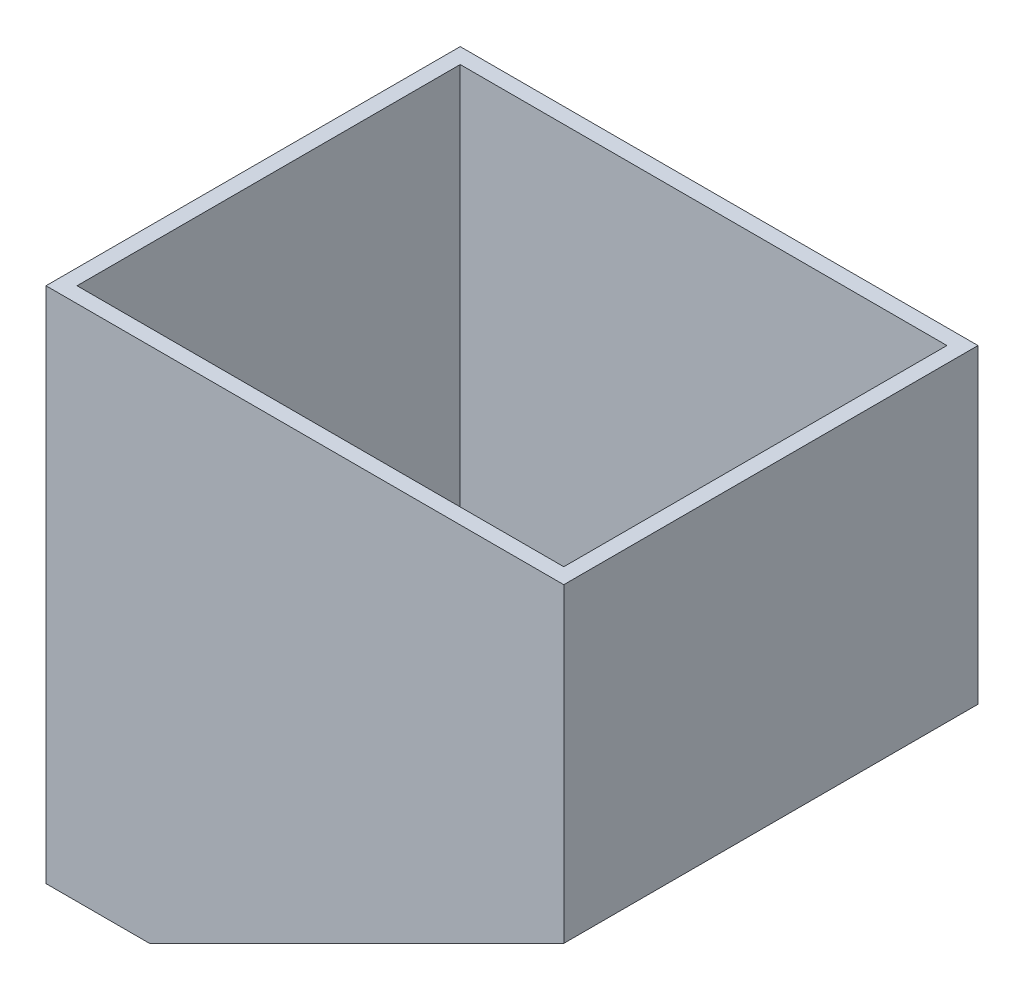
ISO-10303-21;
HEADER;
FILE_DESCRIPTION(('STEP AP214'),'2;1');
FILE_NAME('part.step','',(''),(''),'','','');
FILE_SCHEMA(('AUTOMOTIVE_DESIGN { 1 0 10303 214 1 1 1 1 }'));
ENDSEC;
DATA;
#1=APPLICATION_CONTEXT('core data for automotive mechanical design processes');
#2=APPLICATION_PROTOCOL_DEFINITION('international standard','automotive_design',2000,#1);
#3=PRODUCT_CONTEXT('',#1,'mechanical');
#4=PRODUCT('Part','Part','',(#3));
#5=PRODUCT_RELATED_PRODUCT_CATEGORY('part','',(#4));
#6=PRODUCT_DEFINITION_FORMATION('','',#4);
#7=PRODUCT_DEFINITION_CONTEXT('part definition',#1,'design');
#8=PRODUCT_DEFINITION('design','',#6,#7);
#9=PRODUCT_DEFINITION_SHAPE('','',#8);
#10=(LENGTH_UNIT() NAMED_UNIT(*) SI_UNIT(.MILLI.,.METRE.));
#11=(NAMED_UNIT(*) PLANE_ANGLE_UNIT() SI_UNIT($,.RADIAN.));
#12=(NAMED_UNIT(*) SI_UNIT($,.STERADIAN.) SOLID_ANGLE_UNIT());
#13=UNCERTAINTY_MEASURE_WITH_UNIT(LENGTH_MEASURE(1.E-05),#10,'distance_accuracy_value','');
#14=(GEOMETRIC_REPRESENTATION_CONTEXT(3) GLOBAL_UNCERTAINTY_ASSIGNED_CONTEXT((#13)) GLOBAL_UNIT_ASSIGNED_CONTEXT((#10,
#11,#12)) REPRESENTATION_CONTEXT('',''));
#15=CARTESIAN_POINT('',(0.,0.,0.));
#16=DIRECTION('',(0.,0.,1.));
#17=DIRECTION('',(1.,0.,0.));
#18=AXIS2_PLACEMENT_3D('',#15,#16,#17);
#19=CARTESIAN_POINT('',(100.,-100.,0.));
#20=DIRECTION('',(0.,1.,0.));
#21=DIRECTION('',(0.,0.,1.));
#22=AXIS2_PLACEMENT_3D('',#19,#20,#21);
#23=PLANE('',#22);
#24=DIRECTION('',(0.,0.,1.));
#25=VECTOR('',#24,1.);
#26=CARTESIAN_POINT('',(20.,-100.,-40.));
#27=LINE('',#26,#25);
#28=CARTESIAN_POINT('',(20.,-100.,-80.));
#29=VERTEX_POINT('',#28);
#30=CARTESIAN_POINT('',(20.,-100.,0.));
#31=VERTEX_POINT('',#30);
#32=EDGE_CURVE('E213',#29,#31,#27,.T.);
#33=ORIENTED_EDGE('',*,*,#32,.T.);
#34=DIRECTION('',(-1.,0.,0.));
#35=VECTOR('',#34,1.);
#36=CARTESIAN_POINT('',(100.,-100.,0.));
#37=LINE('',#36,#35);
#38=CARTESIAN_POINT('',(0.,-100.,0.));
#39=VERTEX_POINT('',#38);
#40=EDGE_CURVE('E12',#31,#39,#37,.T.);
#41=ORIENTED_EDGE('',*,*,#40,.T.);
#42=DIRECTION('',(0.,0.,-1.));
#43=VECTOR('',#42,1.);
#44=CARTESIAN_POINT('',(0.,-100.,0.));
#45=LINE('',#44,#43);
#46=CARTESIAN_POINT('',(0.,-100.,-80.));
#47=VERTEX_POINT('',#46);
#48=EDGE_CURVE('E250',#39,#47,#45,.T.);
#49=ORIENTED_EDGE('',*,*,#48,.T.);
#50=DIRECTION('',(-1.,0.,0.));
#51=VECTOR('',#50,1.);
#52=CARTESIAN_POINT('',(100.,-100.,-80.));
#53=LINE('',#52,#51);
#54=EDGE_CURVE('E93',#29,#47,#53,.T.);
#55=ORIENTED_EDGE('',*,*,#54,.F.);
#56=EDGE_LOOP('',(#33,#41,#49,#55));
#57=FACE_BOUND('',#56,.T.);
#58=DIRECTION('',(0.,0.,1.));
#59=VECTOR('',#58,1.);
#60=CARTESIAN_POINT('',(13.2917960675006,-100.,-80.));
#61=LINE('',#60,#59);
#62=CARTESIAN_POINT('',(13.2917960675006,-100.,-77.));
#63=VERTEX_POINT('',#62);
#64=CARTESIAN_POINT('',(13.2917960675006,-100.,-3.00000000000001));
#65=VERTEX_POINT('',#64);
#66=EDGE_CURVE('E176',#63,#65,#61,.T.);
#67=ORIENTED_EDGE('',*,*,#66,.F.);
#68=DIRECTION('',(-1.,0.,0.));
#69=VECTOR('',#68,1.);
#70=CARTESIAN_POINT('',(100.,-100.,-77.));
#71=LINE('',#70,#69);
#72=CARTESIAN_POINT('',(3.,-100.,-77.));
#73=VERTEX_POINT('',#72);
#74=EDGE_CURVE('E208',#63,#73,#71,.T.);
#75=ORIENTED_EDGE('',*,*,#74,.T.);
#76=DIRECTION('',(0.,0.,-1.));
#77=VECTOR('',#76,1.);
#78=CARTESIAN_POINT('',(3.,-100.,0.));
#79=LINE('',#78,#77);
#80=CARTESIAN_POINT('',(3.,-100.,-3.00000000000001));
#81=VERTEX_POINT('',#80);
#82=EDGE_CURVE('E196',#81,#73,#79,.T.);
#83=ORIENTED_EDGE('',*,*,#82,.F.);
#84=DIRECTION('',(-1.,0.,0.));
#85=VECTOR('',#84,1.);
#86=CARTESIAN_POINT('',(100.,-100.,-3.00000000000001));
#87=LINE('',#86,#85);
#88=EDGE_CURVE('E210',#65,#81,#87,.T.);
#89=ORIENTED_EDGE('',*,*,#88,.F.);
#90=EDGE_LOOP('',(#67,#75,#83,#89));
#91=FACE_BOUND('',#90,.T.);
#92=ADVANCED_FACE('F84',(#57,#91),#23,.F.);
#93=CARTESIAN_POINT('',(100.,0.,0.));
#94=DIRECTION('',(0.,-1.,0.));
#95=DIRECTION('',(0.,0.,-1.));
#96=AXIS2_PLACEMENT_3D('',#93,#94,#95);
#97=PLANE('',#96);
#98=DIRECTION('',(0.,0.,1.));
#99=VECTOR('',#98,1.);
#100=CARTESIAN_POINT('',(0.,0.,0.));
#101=LINE('',#100,#99);
#102=CARTESIAN_POINT('',(0.,0.,-80.));
#103=VERTEX_POINT('',#102);
#104=CARTESIAN_POINT('',(0.,0.,0.));
#105=VERTEX_POINT('',#104);
#106=EDGE_CURVE('E240',#103,#105,#101,.T.);
#107=ORIENTED_EDGE('',*,*,#106,.T.);
#108=DIRECTION('',(-1.,0.,0.));
#109=VECTOR('',#108,1.);
#110=CARTESIAN_POINT('',(100.,0.,0.));
#111=LINE('',#110,#109);
#112=CARTESIAN_POINT('',(100.,0.,0.));
#113=VERTEX_POINT('',#112);
#114=EDGE_CURVE('E246',#113,#105,#111,.T.);
#115=ORIENTED_EDGE('',*,*,#114,.F.);
#116=DIRECTION('',(0.,0.,1.));
#117=VECTOR('',#116,1.);
#118=CARTESIAN_POINT('',(100.,0.,0.));
#119=LINE('',#118,#117);
#120=CARTESIAN_POINT('',(100.,0.,-80.));
#121=VERTEX_POINT('',#120);
#122=EDGE_CURVE('E243',#121,#113,#119,.T.);
#123=ORIENTED_EDGE('',*,*,#122,.F.);
#124=DIRECTION('',(-1.,0.,0.));
#125=VECTOR('',#124,1.);
#126=CARTESIAN_POINT('',(100.,0.,-80.));
#127=LINE('',#126,#125);
#128=EDGE_CURVE('E262',#121,#103,#127,.T.);
#129=ORIENTED_EDGE('',*,*,#128,.T.);
#130=EDGE_LOOP('',(#107,#115,#123,#129));
#131=FACE_BOUND('',#130,.T.);
#132=DIRECTION('',(0.,0.,1.));
#133=VECTOR('',#132,1.);
#134=CARTESIAN_POINT('',(3.,0.,0.));
#135=LINE('',#134,#133);
#136=CARTESIAN_POINT('',(3.,0.,-77.));
#137=VERTEX_POINT('',#136);
#138=CARTESIAN_POINT('',(3.,0.,-3.));
#139=VERTEX_POINT('',#138);
#140=EDGE_CURVE('E186',#137,#139,#135,.T.);
#141=ORIENTED_EDGE('',*,*,#140,.F.);
#142=DIRECTION('',(-1.,0.,0.));
#143=VECTOR('',#142,1.);
#144=CARTESIAN_POINT('',(100.,0.,-77.));
#145=LINE('',#144,#143);
#146=CARTESIAN_POINT('',(97.,0.,-77.));
#147=VERTEX_POINT('',#146);
#148=EDGE_CURVE('E204',#147,#137,#145,.T.);
#149=ORIENTED_EDGE('',*,*,#148,.F.);
#150=DIRECTION('',(0.,0.,1.));
#151=VECTOR('',#150,1.);
#152=CARTESIAN_POINT('',(97.,0.,0.));
#153=LINE('',#152,#151);
#154=CARTESIAN_POINT('',(97.,0.,-3.));
#155=VERTEX_POINT('',#154);
#156=EDGE_CURVE('E108',#147,#155,#153,.T.);
#157=ORIENTED_EDGE('',*,*,#156,.T.);
#158=DIRECTION('',(-1.,0.,0.));
#159=VECTOR('',#158,1.);
#160=CARTESIAN_POINT('',(100.,0.,-3.));
#161=LINE('',#160,#159);
#162=EDGE_CURVE('E184',#155,#139,#161,.T.);
#163=ORIENTED_EDGE('',*,*,#162,.T.);
#164=EDGE_LOOP('',(#141,#149,#157,#163));
#165=FACE_BOUND('',#164,.T.);
#166=ADVANCED_FACE('F282',(#131,#165),#97,.F.);
#167=CARTESIAN_POINT('',(100.,0.,0.));
#168=DIRECTION('',(0.,0.,-1.));
#169=DIRECTION('',(0.,1.,0.));
#170=AXIS2_PLACEMENT_3D('',#167,#168,#169);
#171=PLANE('',#170);
#172=DIRECTION('',(-0.894427190999916,-0.447213595499958,0.));
#173=VECTOR('',#172,1.);
#174=CARTESIAN_POINT('',(60.,-80.,0.));
#175=LINE('',#174,#173);
#176=CARTESIAN_POINT('',(100.,-60.,0.));
#177=VERTEX_POINT('',#176);
#178=EDGE_CURVE('E229',#177,#31,#175,.T.);
#179=ORIENTED_EDGE('',*,*,#178,.F.);
#180=DIRECTION('',(0.,-1.,0.));
#181=VECTOR('',#180,1.);
#182=CARTESIAN_POINT('',(100.,0.,0.));
#183=LINE('',#182,#181);
#184=EDGE_CURVE('E235',#113,#177,#183,.T.);
#185=ORIENTED_EDGE('',*,*,#184,.F.);
#186=ORIENTED_EDGE('',*,*,#114,.T.);
#187=DIRECTION('',(0.,-1.,0.));
#188=VECTOR('',#187,1.);
#189=CARTESIAN_POINT('',(0.,0.,0.));
#190=LINE('',#189,#188);
#191=EDGE_CURVE('E225',#105,#39,#190,.T.);
#192=ORIENTED_EDGE('',*,*,#191,.T.);
#193=ORIENTED_EDGE('',*,*,#40,.F.);
#194=EDGE_LOOP('',(#179,#185,#186,#192,#193));
#195=FACE_BOUND('',#194,.T.);
#196=ADVANCED_FACE('F86',(#195),#171,.F.);
#197=CARTESIAN_POINT('',(100.,0.,-80.));
#198=DIRECTION('',(0.,0.,1.));
#199=DIRECTION('',(1.,0.,0.));
#200=AXIS2_PLACEMENT_3D('',#197,#198,#199);
#201=PLANE('',#200);
#202=DIRECTION('',(-0.894427190999916,-0.447213595499958,0.));
#203=VECTOR('',#202,1.);
#204=CARTESIAN_POINT('',(60.,-80.,-80.));
#205=LINE('',#204,#203);
#206=CARTESIAN_POINT('',(100.,-60.,-80.));
#207=VERTEX_POINT('',#206);
#208=EDGE_CURVE('E221',#207,#29,#205,.T.);
#209=ORIENTED_EDGE('',*,*,#208,.T.);
#210=ORIENTED_EDGE('',*,*,#54,.T.);
#211=DIRECTION('',(0.,1.,0.));
#212=VECTOR('',#211,1.);
#213=CARTESIAN_POINT('',(0.,0.,-80.));
#214=LINE('',#213,#212);
#215=EDGE_CURVE('E254',#47,#103,#214,.T.);
#216=ORIENTED_EDGE('',*,*,#215,.T.);
#217=ORIENTED_EDGE('',*,*,#128,.F.);
#218=DIRECTION('',(0.,1.,0.));
#219=VECTOR('',#218,1.);
#220=CARTESIAN_POINT('',(100.,0.,-80.));
#221=LINE('',#220,#219);
#222=EDGE_CURVE('E239',#207,#121,#221,.T.);
#223=ORIENTED_EDGE('',*,*,#222,.F.);
#224=EDGE_LOOP('',(#209,#210,#216,#217,#223));
#225=FACE_BOUND('',#224,.T.);
#226=ADVANCED_FACE('F268',(#225),#201,.F.);
#227=CARTESIAN_POINT('',(100.,0.,0.));
#228=DIRECTION('',(1.,0.,0.));
#229=DIRECTION('',(0.,0.,-1.));
#230=AXIS2_PLACEMENT_3D('',#227,#228,#229);
#231=PLANE('',#230);
#232=ORIENTED_EDGE('',*,*,#184,.T.);
#233=DIRECTION('',(0.,0.,1.));
#234=VECTOR('',#233,1.);
#235=CARTESIAN_POINT('',(100.,-60.,-40.));
#236=LINE('',#235,#234);
#237=EDGE_CURVE('E226',#207,#177,#236,.T.);
#238=ORIENTED_EDGE('',*,*,#237,.F.);
#239=ORIENTED_EDGE('',*,*,#222,.T.);
#240=ORIENTED_EDGE('',*,*,#122,.T.);
#241=EDGE_LOOP('',(#232,#238,#239,#240));
#242=FACE_BOUND('',#241,.T.);
#243=ADVANCED_FACE('F290',(#242),#231,.T.);
#244=CARTESIAN_POINT('',(0.,0.,0.));
#245=DIRECTION('',(1.,0.,0.));
#246=DIRECTION('',(0.,0.,-1.));
#247=AXIS2_PLACEMENT_3D('',#244,#245,#246);
#248=PLANE('',#247);
#249=ORIENTED_EDGE('',*,*,#191,.F.);
#250=ORIENTED_EDGE('',*,*,#106,.F.);
#251=ORIENTED_EDGE('',*,*,#215,.F.);
#252=ORIENTED_EDGE('',*,*,#48,.F.);
#253=EDGE_LOOP('',(#249,#250,#251,#252));
#254=FACE_BOUND('',#253,.T.);
#255=ADVANCED_FACE('F279',(#254),#248,.F.);
#256=CARTESIAN_POINT('',(100.,-60.,-80.));
#257=DIRECTION('',(0.447213595499958,-0.894427190999916,0.));
#258=DIRECTION('',(0.,0.,1.));
#259=AXIS2_PLACEMENT_3D('',#256,#257,#258);
#260=PLANE('',#259);
#261=ORIENTED_EDGE('',*,*,#237,.T.);
#262=ORIENTED_EDGE('',*,*,#178,.T.);
#263=ORIENTED_EDGE('',*,*,#32,.F.);
#264=ORIENTED_EDGE('',*,*,#208,.F.);
#265=EDGE_LOOP('',(#261,#262,#263,#264));
#266=FACE_BOUND('',#265,.T.);
#267=ADVANCED_FACE('F292',(#266),#260,.T.);
#268=CARTESIAN_POINT('',(100.,0.,-3.));
#269=DIRECTION('',(0.,0.,-1.));
#270=DIRECTION('',(0.,1.,0.));
#271=AXIS2_PLACEMENT_3D('',#268,#269,#270);
#272=PLANE('',#271);
#273=DIRECTION('',(-0.894427190999916,-0.447213595499958,0.));
#274=VECTOR('',#273,1.);
#275=CARTESIAN_POINT('',(122.6583592135,-45.3167184270003,-3.00000000000001));
#276=LINE('',#275,#274);
#277=CARTESIAN_POINT('',(97.,-58.1458980337503,-3.00000000000001));
#278=VERTEX_POINT('',#277);
#279=EDGE_CURVE('E171',#278,#65,#276,.T.);
#280=ORIENTED_EDGE('',*,*,#279,.T.);
#281=ORIENTED_EDGE('',*,*,#88,.T.);
#282=DIRECTION('',(0.,-1.,0.));
#283=VECTOR('',#282,1.);
#284=CARTESIAN_POINT('',(3.,0.,-3.));
#285=LINE('',#284,#283);
#286=EDGE_CURVE('E193',#139,#81,#285,.T.);
#287=ORIENTED_EDGE('',*,*,#286,.F.);
#288=ORIENTED_EDGE('',*,*,#162,.F.);
#289=DIRECTION('',(0.,-1.,0.));
#290=VECTOR('',#289,1.);
#291=CARTESIAN_POINT('',(97.,0.,-3.));
#292=LINE('',#291,#290);
#293=EDGE_CURVE('E166',#155,#278,#292,.T.);
#294=ORIENTED_EDGE('',*,*,#293,.T.);
#295=EDGE_LOOP('',(#280,#281,#287,#288,#294));
#296=FACE_BOUND('',#295,.T.);
#297=ADVANCED_FACE('F181',(#296),#272,.T.);
#298=CARTESIAN_POINT('',(100.,0.,-77.));
#299=DIRECTION('',(0.,0.,1.));
#300=DIRECTION('',(1.,0.,0.));
#301=AXIS2_PLACEMENT_3D('',#298,#299,#300);
#302=PLANE('',#301);
#303=DIRECTION('',(-0.894427190999916,-0.447213595499958,0.));
#304=VECTOR('',#303,1.);
#305=CARTESIAN_POINT('',(98.6583592135001,-57.3167184270003,-77.));
#306=LINE('',#305,#304);
#307=CARTESIAN_POINT('',(97.,-58.1458980337503,-77.));
#308=VERTEX_POINT('',#307);
#309=EDGE_CURVE('E170',#308,#63,#306,.T.);
#310=ORIENTED_EDGE('',*,*,#309,.F.);
#311=DIRECTION('',(0.,1.,0.));
#312=VECTOR('',#311,1.);
#313=CARTESIAN_POINT('',(97.,0.,-77.));
#314=LINE('',#313,#312);
#315=EDGE_CURVE('E167',#308,#147,#314,.T.);
#316=ORIENTED_EDGE('',*,*,#315,.T.);
#317=ORIENTED_EDGE('',*,*,#148,.T.);
#318=DIRECTION('',(0.,1.,0.));
#319=VECTOR('',#318,1.);
#320=CARTESIAN_POINT('',(3.,0.,-77.));
#321=LINE('',#320,#319);
#322=EDGE_CURVE('E100',#73,#137,#321,.T.);
#323=ORIENTED_EDGE('',*,*,#322,.F.);
#324=ORIENTED_EDGE('',*,*,#74,.F.);
#325=EDGE_LOOP('',(#310,#316,#317,#323,#324));
#326=FACE_BOUND('',#325,.T.);
#327=ADVANCED_FACE('F300',(#326),#302,.T.);
#328=CARTESIAN_POINT('',(97.,0.,0.));
#329=DIRECTION('',(1.,0.,0.));
#330=DIRECTION('',(0.,0.,-1.));
#331=AXIS2_PLACEMENT_3D('',#328,#329,#330);
#332=PLANE('',#331);
#333=ORIENTED_EDGE('',*,*,#293,.F.);
#334=ORIENTED_EDGE('',*,*,#156,.F.);
#335=ORIENTED_EDGE('',*,*,#315,.F.);
#336=DIRECTION('',(0.,0.,1.));
#337=VECTOR('',#336,1.);
#338=CARTESIAN_POINT('',(97.,-58.1458980337503,-80.));
#339=LINE('',#338,#337);
#340=EDGE_CURVE('E162',#308,#278,#339,.T.);
#341=ORIENTED_EDGE('',*,*,#340,.T.);
#342=EDGE_LOOP('',(#333,#334,#335,#341));
#343=FACE_BOUND('',#342,.T.);
#344=ADVANCED_FACE('F164',(#343),#332,.F.);
#345=CARTESIAN_POINT('',(3.,0.,0.));
#346=DIRECTION('',(1.,0.,0.));
#347=DIRECTION('',(0.,0.,-1.));
#348=AXIS2_PLACEMENT_3D('',#345,#346,#347);
#349=PLANE('',#348);
#350=ORIENTED_EDGE('',*,*,#286,.T.);
#351=ORIENTED_EDGE('',*,*,#82,.T.);
#352=ORIENTED_EDGE('',*,*,#322,.T.);
#353=ORIENTED_EDGE('',*,*,#140,.T.);
#354=EDGE_LOOP('',(#350,#351,#352,#353));
#355=FACE_BOUND('',#354,.T.);
#356=ADVANCED_FACE('F370',(#355),#349,.T.);
#357=CARTESIAN_POINT('',(98.6583592135001,-57.3167184270003,-80.));
#358=DIRECTION('',(0.447213595499958,-0.894427190999916,0.));
#359=DIRECTION('',(0.,0.,1.));
#360=AXIS2_PLACEMENT_3D('',#357,#358,#359);
#361=PLANE('',#360);
#362=ORIENTED_EDGE('',*,*,#340,.F.);
#363=ORIENTED_EDGE('',*,*,#309,.T.);
#364=ORIENTED_EDGE('',*,*,#66,.T.);
#365=ORIENTED_EDGE('',*,*,#279,.F.);
#366=EDGE_LOOP('',(#362,#363,#364,#365));
#367=FACE_BOUND('',#366,.T.);
#368=ADVANCED_FACE('F174',(#367),#361,.F.);
#369=CLOSED_SHELL('',(#92,#166,#196,#226,#243,#255,#267,#297,#327,#344,#356,#368));
#370=MANIFOLD_SOLID_BREP('B2',#369);
#371=ADVANCED_BREP_SHAPE_REPRESENTATION('',(#18,#370),#14);
#372=SHAPE_DEFINITION_REPRESENTATION(#9,#371);
ENDSEC;
END-ISO-10303-21;
